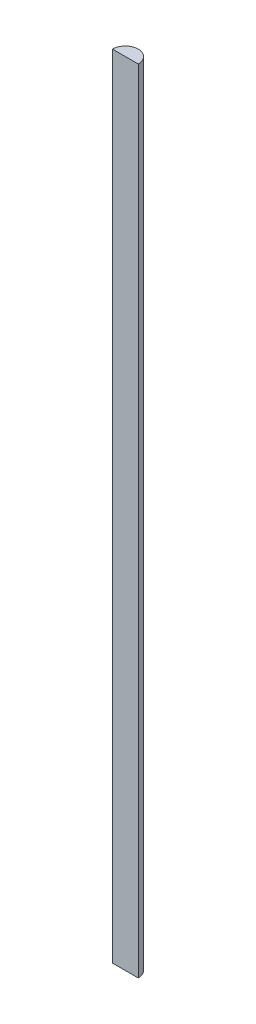
ISO-10303-21;
HEADER;
FILE_DESCRIPTION(('STEP AP214'),'2;1');
FILE_NAME('part.step','',(''),(''),'','','');
FILE_SCHEMA(('AUTOMOTIVE_DESIGN { 1 0 10303 214 1 1 1 1 }'));
ENDSEC;
DATA;
#1=APPLICATION_CONTEXT('core data for automotive mechanical design processes');
#2=APPLICATION_PROTOCOL_DEFINITION('international standard','automotive_design',2000,#1);
#3=PRODUCT_CONTEXT('',#1,'mechanical');
#4=PRODUCT('Part','Part','',(#3));
#5=PRODUCT_RELATED_PRODUCT_CATEGORY('part','',(#4));
#6=PRODUCT_DEFINITION_FORMATION('','',#4);
#7=PRODUCT_DEFINITION_CONTEXT('part definition',#1,'design');
#8=PRODUCT_DEFINITION('design','',#6,#7);
#9=PRODUCT_DEFINITION_SHAPE('','',#8);
#10=(LENGTH_UNIT() NAMED_UNIT(*) SI_UNIT(.MILLI.,.METRE.));
#11=(NAMED_UNIT(*) PLANE_ANGLE_UNIT() SI_UNIT($,.RADIAN.));
#12=(NAMED_UNIT(*) SI_UNIT($,.STERADIAN.) SOLID_ANGLE_UNIT());
#13=UNCERTAINTY_MEASURE_WITH_UNIT(LENGTH_MEASURE(1.E-05),#10,'distance_accuracy_value','');
#14=(GEOMETRIC_REPRESENTATION_CONTEXT(3) GLOBAL_UNCERTAINTY_ASSIGNED_CONTEXT((#13)) GLOBAL_UNIT_ASSIGNED_CONTEXT((#10,
#11,#12)) REPRESENTATION_CONTEXT('',''));
#15=CARTESIAN_POINT('',(0.,0.,0.));
#16=DIRECTION('',(0.,0.,1.));
#17=DIRECTION('',(1.,0.,0.));
#18=AXIS2_PLACEMENT_3D('',#15,#16,#17);
#19=CARTESIAN_POINT('',(-2.45,150.,0.));
#20=DIRECTION('',(0.,0.,-1.));
#21=DIRECTION('',(-1.,0.,0.));
#22=AXIS2_PLACEMENT_3D('',#19,#20,#21);
#23=PLANE('',#22);
#24=DIRECTION('',(1.,0.,0.));
#25=VECTOR('',#24,1.);
#26=CARTESIAN_POINT('',(-2.45,0.,0.));
#27=LINE('',#26,#25);
#28=CARTESIAN_POINT('',(-2.45,0.,0.));
#29=VERTEX_POINT('',#28);
#30=CARTESIAN_POINT('',(2.45,0.,0.));
#31=VERTEX_POINT('',#30);
#32=EDGE_CURVE('E64',#29,#31,#27,.T.);
#33=ORIENTED_EDGE('',*,*,#32,.T.);
#34=DIRECTION('',(0.,-1.,0.));
#35=VECTOR('',#34,1.);
#36=CARTESIAN_POINT('',(2.45,150.,0.));
#37=LINE('',#36,#35);
#38=CARTESIAN_POINT('',(2.45,150.,0.));
#39=VERTEX_POINT('',#38);
#40=EDGE_CURVE('E11',#39,#31,#37,.T.);
#41=ORIENTED_EDGE('',*,*,#40,.F.);
#42=DIRECTION('',(1.,0.,0.));
#43=VECTOR('',#42,1.);
#44=CARTESIAN_POINT('',(-2.45,150.,0.));
#45=LINE('',#44,#43);
#46=CARTESIAN_POINT('',(-2.45,150.,0.));
#47=VERTEX_POINT('',#46);
#48=EDGE_CURVE('E63',#47,#39,#45,.T.);
#49=ORIENTED_EDGE('',*,*,#48,.F.);
#50=DIRECTION('',(0.,-1.,0.));
#51=VECTOR('',#50,1.);
#52=CARTESIAN_POINT('',(-2.45,150.,0.));
#53=LINE('',#52,#51);
#54=EDGE_CURVE('E41',#47,#29,#53,.T.);
#55=ORIENTED_EDGE('',*,*,#54,.T.);
#56=EDGE_LOOP('',(#33,#41,#49,#55));
#57=FACE_BOUND('',#56,.T.);
#58=ADVANCED_FACE('F33',(#57),#23,.F.);
#59=CARTESIAN_POINT('',(0.,150.,0.));
#60=DIRECTION('',(0.,-1.,0.));
#61=DIRECTION('',(0.,0.,-1.));
#62=AXIS2_PLACEMENT_3D('',#59,#60,#61);
#63=CYLINDRICAL_SURFACE('',#62,2.45);
#64=CARTESIAN_POINT('',(0.,0.,0.));
#65=DIRECTION('',(0.,1.,0.));
#66=DIRECTION('',(0.,0.,1.));
#67=AXIS2_PLACEMENT_3D('',#64,#65,#66);
#68=CIRCLE('',#67,2.45);
#69=EDGE_CURVE('E56',#31,#29,#68,.T.);
#70=ORIENTED_EDGE('',*,*,#69,.T.);
#71=ORIENTED_EDGE('',*,*,#54,.F.);
#72=CARTESIAN_POINT('',(0.,150.,0.));
#73=DIRECTION('',(0.,1.,0.));
#74=DIRECTION('',(0.,0.,1.));
#75=AXIS2_PLACEMENT_3D('',#72,#73,#74);
#76=CIRCLE('',#75,2.45);
#77=EDGE_CURVE('E48',#39,#47,#76,.T.);
#78=ORIENTED_EDGE('',*,*,#77,.F.);
#79=ORIENTED_EDGE('',*,*,#40,.T.);
#80=EDGE_LOOP('',(#70,#71,#78,#79));
#81=FACE_BOUND('',#80,.T.);
#82=ADVANCED_FACE('F59',(#81),#63,.T.);
#83=CARTESIAN_POINT('',(0.,150.,0.));
#84=DIRECTION('',(0.,1.,0.));
#85=DIRECTION('',(0.,0.,1.));
#86=AXIS2_PLACEMENT_3D('',#83,#84,#85);
#87=PLANE('',#86);
#88=ORIENTED_EDGE('',*,*,#48,.T.);
#89=ORIENTED_EDGE('',*,*,#77,.T.);
#90=EDGE_LOOP('',(#88,#89));
#91=FACE_BOUND('',#90,.T.);
#92=ADVANCED_FACE('F71',(#91),#87,.T.);
#93=CARTESIAN_POINT('',(0.,0.,0.));
#94=DIRECTION('',(0.,1.,0.));
#95=DIRECTION('',(0.,0.,1.));
#96=AXIS2_PLACEMENT_3D('',#93,#94,#95);
#97=PLANE('',#96);
#98=ORIENTED_EDGE('',*,*,#32,.F.);
#99=ORIENTED_EDGE('',*,*,#69,.F.);
#100=EDGE_LOOP('',(#98,#99));
#101=FACE_BOUND('',#100,.T.);
#102=ADVANCED_FACE('F67',(#101),#97,.F.);
#103=CLOSED_SHELL('',(#58,#82,#92,#102));
#104=MANIFOLD_SOLID_BREP('B2',#103);
#105=ADVANCED_BREP_SHAPE_REPRESENTATION('',(#18,#104),#14);
#106=SHAPE_DEFINITION_REPRESENTATION(#9,#105);
ENDSEC;
END-ISO-10303-21;
